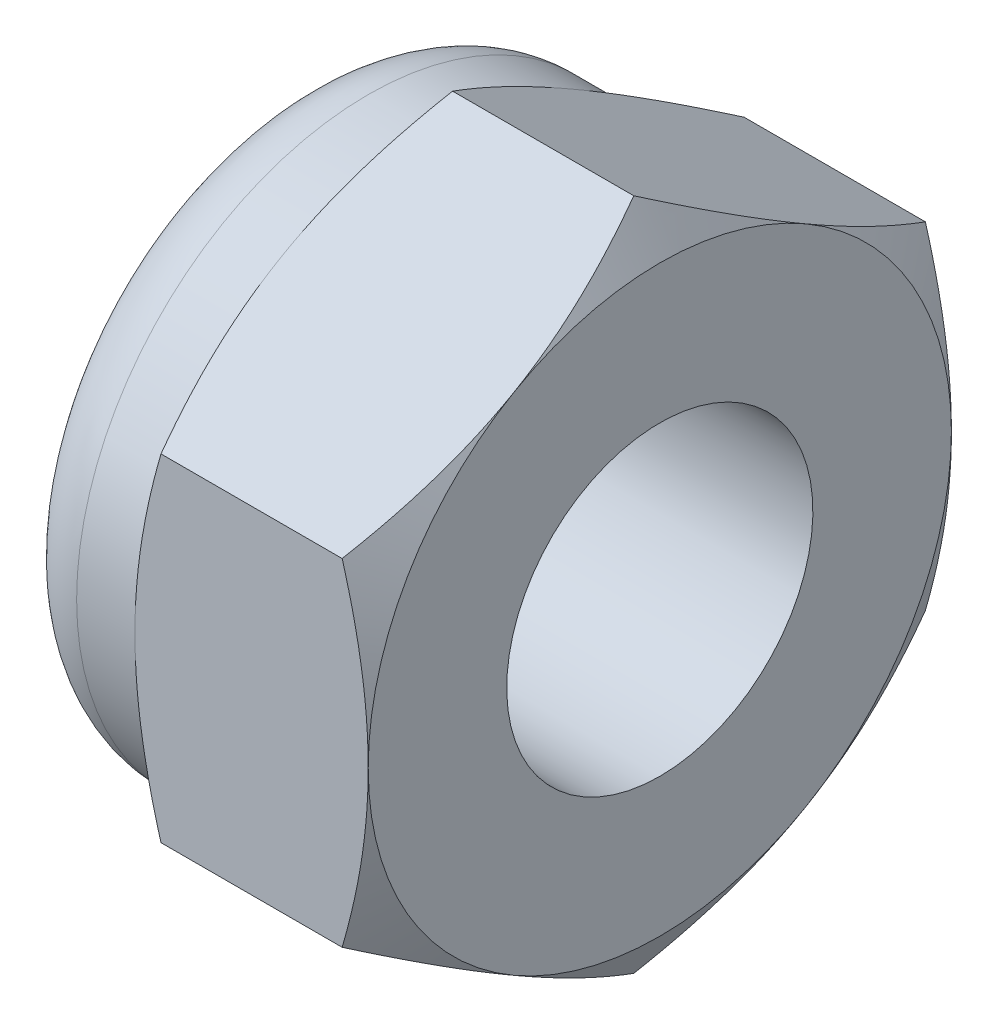
ISO-10303-21;
HEADER;
FILE_DESCRIPTION(('STEP AP214'),'2;1');
FILE_NAME('part.step','',(''),(''),'','','');
FILE_SCHEMA(('AUTOMOTIVE_DESIGN { 1 0 10303 214 1 1 1 1 }'));
ENDSEC;
DATA;
#1=APPLICATION_CONTEXT('core data for automotive mechanical design processes');
#2=APPLICATION_PROTOCOL_DEFINITION('international standard','automotive_design',2000,#1);
#3=PRODUCT_CONTEXT('',#1,'mechanical');
#4=PRODUCT('Part','Part','',(#3));
#5=PRODUCT_RELATED_PRODUCT_CATEGORY('part','',(#4));
#6=PRODUCT_DEFINITION_FORMATION('','',#4);
#7=PRODUCT_DEFINITION_CONTEXT('part definition',#1,'design');
#8=PRODUCT_DEFINITION('design','',#6,#7);
#9=PRODUCT_DEFINITION_SHAPE('','',#8);
#10=(LENGTH_UNIT() NAMED_UNIT(*) SI_UNIT(.MILLI.,.METRE.));
#11=(NAMED_UNIT(*) PLANE_ANGLE_UNIT() SI_UNIT($,.RADIAN.));
#12=(NAMED_UNIT(*) SI_UNIT($,.STERADIAN.) SOLID_ANGLE_UNIT());
#13=UNCERTAINTY_MEASURE_WITH_UNIT(LENGTH_MEASURE(1.E-05),#10,'distance_accuracy_value','');
#14=(GEOMETRIC_REPRESENTATION_CONTEXT(3) GLOBAL_UNCERTAINTY_ASSIGNED_CONTEXT((#13)) GLOBAL_UNIT_ASSIGNED_CONTEXT((#10,
#11,#12)) REPRESENTATION_CONTEXT('',''));
#15=CARTESIAN_POINT('',(0.,0.,0.));
#16=DIRECTION('',(0.,0.,1.));
#17=DIRECTION('',(1.,0.,0.));
#18=AXIS2_PLACEMENT_3D('',#15,#16,#17);
#19=CARTESIAN_POINT('',(-5.,2.30940107675851,-4.));
#20=DIRECTION('',(0.,0.866025403784439,-0.5));
#21=DIRECTION('',(0.,0.5,0.866025403784439));
#22=AXIS2_PLACEMENT_3D('',#19,#20,#21);
#23=PLANE('',#22);
#24=DIRECTION('',(1.,0.,0.));
#25=VECTOR('',#24,1.);
#26=CARTESIAN_POINT('',(-5.,2.30940107675851,-4.));
#27=LINE('',#26,#25);
#28=CARTESIAN_POINT('',(-2.84273441009184,2.30940107675851,-4.));
#29=VERTEX_POINT('',#28);
#30=CARTESIAN_POINT('',(-0.357265589908158,2.30940107675851,-4.));
#31=VERTEX_POINT('',#30);
#32=EDGE_CURVE('E144',#29,#31,#27,.T.);
#33=ORIENTED_EDGE('',*,*,#32,.F.);
#34=CARTESIAN_POINT('',(-2.84266774092524,2.30928560670467,-4.0002));
#35=CARTESIAN_POINT('',(-2.90128212635172,2.41077174646171,-3.82442084967677));
#36=CARTESIAN_POINT('',(-2.95458967853774,2.513133908835,-3.64712438367362));
#37=CARTESIAN_POINT('',(-3.0476383292536,2.71963072479812,-3.28946140682429));
#38=CARTESIAN_POINT('',(-3.0873465109703,2.82376904741904,-3.10908854102985));
#39=CARTESIAN_POINT('',(-3.14915778471972,3.03075510011795,-2.75057818129721));
#40=CARTESIAN_POINT('',(-3.17167226847711,3.13357098372492,-2.57249584706486));
#41=CARTESIAN_POINT('',(-3.19854937685342,3.33968651028528,-2.21549328283349));
#42=CARTESIAN_POINT('',(-3.20293425857306,3.44298540411434,-2.0365743503559));
#43=CARTESIAN_POINT('',(-3.19380992706003,3.63600352522932,-1.70225715780327));
#44=CARTESIAN_POINT('',(-3.18254104601201,3.72575165335065,-1.54680884001294));
#45=CARTESIAN_POINT('',(-3.14682600920181,3.90466320392054,-1.23692494436495));
#46=CARTESIAN_POINT('',(-3.12236765428847,3.99382600759478,-1.08249043825587));
#47=CARTESIAN_POINT('',(-3.06122393508071,4.17310641015197,-0.771967672225425));
#48=CARTESIAN_POINT('',(-3.02427939634514,4.26320131938131,-0.615918711936901));
#49=CARTESIAN_POINT('',(-2.94042992745197,4.4420474282755,-0.306148164596164));
#50=CARTESIAN_POINT('',(-2.89354469778726,4.53080091904966,-0.152422609226224));
#51=CARTESIAN_POINT('',(-2.84266774092524,4.61891762357084,0.000199999999999453));
#52=B_SPLINE_CURVE_WITH_KNOTS('',3,(#34,#35,#36,#37,#38,#39,#40,#41,#42,#43,#44,#45,#46,#47,#48,
#49,#50,#51),.UNSPECIFIED.,.F.,.F.,(4,2,2,2,2,2,2,2,4),(0.,0.634047835695964,1.26961969224543,
1.88946157213122,2.50854226669297,3.04757825393385,3.58711366126903,4.13861653143763,
4.68903648037742),.UNSPECIFIED.);
#53=CARTESIAN_POINT('',(-3.2,3.46410161513775,-2.));
#54=VERTEX_POINT('',#53);
#55=EDGE_CURVE('E264',#29,#54,#52,.T.);
#56=ORIENTED_EDGE('',*,*,#55,.T.);
#57=CARTESIAN_POINT('',(-2.84273441009184,4.61880215351701,0.));
#58=VERTEX_POINT('',#57);
#59=EDGE_CURVE('E258',#54,#58,#52,.T.);
#60=ORIENTED_EDGE('',*,*,#59,.T.);
#61=DIRECTION('',(1.,0.,0.));
#62=VECTOR('',#61,1.);
#63=CARTESIAN_POINT('',(-5.,4.61880215351701,0.));
#64=LINE('',#63,#62);
#65=CARTESIAN_POINT('',(-0.357265589908158,4.61880215351701,0.));
#66=VERTEX_POINT('',#65);
#67=EDGE_CURVE('E151',#58,#66,#64,.T.);
#68=ORIENTED_EDGE('',*,*,#67,.T.);
#69=CARTESIAN_POINT('',(-0.357332259074763,4.61891762357084,0.000199999999999655));
#70=CARTESIAN_POINT('',(-0.298717873648277,4.5174314838138,-0.175579150323229));
#71=CARTESIAN_POINT('',(-0.245410321462257,4.41506932144052,-0.352875616326382));
#72=CARTESIAN_POINT('',(-0.152361670746398,4.2085725054774,-0.710538593175708));
#73=CARTESIAN_POINT('',(-0.112653489029699,4.10443418285647,-0.890911458970152));
#74=CARTESIAN_POINT('',(-0.0508422152802733,3.89744813015756,-1.24942181870279));
#75=CARTESIAN_POINT('',(-0.0283277315228823,3.79463224655059,-1.42750415293514));
#76=CARTESIAN_POINT('',(-0.00145062314657792,3.58851671999023,-1.78450671716651));
#77=CARTESIAN_POINT('',(0.00293425857305713,3.48521782616117,-1.9634256496441));
#78=CARTESIAN_POINT('',(-0.00619007293996925,3.29219970504619,-2.29774284219673));
#79=CARTESIAN_POINT('',(-0.01745895398799,3.20245157692487,-2.45319115998707));
#80=CARTESIAN_POINT('',(-0.0531739907981864,3.02354002635497,-2.76307505563506));
#81=CARTESIAN_POINT('',(-0.077632345711527,2.93437722268073,-2.91750956174413));
#82=CARTESIAN_POINT('',(-0.138776064919284,2.75509682012354,-3.22803232777458));
#83=CARTESIAN_POINT('',(-0.175720603654858,2.6650019108942,-3.3840812880631));
#84=CARTESIAN_POINT('',(-0.259570072548021,2.48615580200001,-3.69385183540384));
#85=CARTESIAN_POINT('',(-0.306455302212735,2.39740231122585,-3.84757739077378));
#86=CARTESIAN_POINT('',(-0.357332259074763,2.30928560670467,-4.0002));
#87=B_SPLINE_CURVE_WITH_KNOTS('',3,(#69,#70,#71,#72,#73,#74,#75,#76,#77,#78,#79,#80,#81,#82,#83,
#84,#85,#86),.UNSPECIFIED.,.F.,.F.,(4,2,2,2,2,2,2,2,4),(0.,0.634047835695966,1.26961969224543,
1.88946157213122,2.50854226669297,3.04757825393385,3.58711366126903,4.13861653143763,
4.68903648037743),.UNSPECIFIED.);
#88=CARTESIAN_POINT('',(0.,3.46410161513775,-2.));
#89=VERTEX_POINT('',#88);
#90=EDGE_CURVE('E309',#66,#89,#87,.T.);
#91=ORIENTED_EDGE('',*,*,#90,.T.);
#92=EDGE_CURVE('E212',#89,#31,#87,.T.);
#93=ORIENTED_EDGE('',*,*,#92,.T.);
#94=EDGE_LOOP('',(#33,#56,#60,#68,#91,#93));
#95=FACE_BOUND('',#94,.T.);
#96=ADVANCED_FACE('F16',(#95),#23,.T.);
#97=CARTESIAN_POINT('',(-5.,-2.30940107675851,-4.));
#98=DIRECTION('',(0.,0.,-1.));
#99=DIRECTION('',(-1.,0.,0.));
#100=AXIS2_PLACEMENT_3D('',#97,#98,#99);
#101=PLANE('',#100);
#102=DIRECTION('',(1.,0.,0.));
#103=VECTOR('',#102,1.);
#104=CARTESIAN_POINT('',(-5.,-2.30940107675851,-4.));
#105=LINE('',#104,#103);
#106=CARTESIAN_POINT('',(-2.84273441009184,-2.30940107675851,-4.));
#107=VERTEX_POINT('',#106);
#108=CARTESIAN_POINT('',(-0.357265589908158,-2.30940107675851,-4.));
#109=VERTEX_POINT('',#108);
#110=EDGE_CURVE('E141',#107,#109,#105,.T.);
#111=ORIENTED_EDGE('',*,*,#110,.F.);
#112=CARTESIAN_POINT('',(-1.28589317875939,-6.12487198995892,-4.));
#113=CARTESIAN_POINT('',(-1.37076372923312,-5.94924937038676,-4.));
#114=CARTESIAN_POINT('',(-1.45479059619262,-5.77321152095285,-4.));
#115=CARTESIAN_POINT('',(-1.62067485320285,-5.42008084777954,-4.));
#116=CARTESIAN_POINT('',(-1.70253186763278,-5.24298784779927,-4.));
#117=CARTESIAN_POINT('',(-1.86402553694145,-4.88656571686333,-4.));
#118=CARTESIAN_POINT('',(-1.94364680493697,-4.70722958889362,-4.));
#119=CARTESIAN_POINT('',(-2.09946941457971,-4.34708334747263,-4.));
#120=CARTESIAN_POINT('',(-2.17567093449199,-4.16627331143537,-4.));
#121=CARTESIAN_POINT('',(-2.32464934960564,-3.80064706744977,-4.));
#122=CARTESIAN_POINT('',(-2.39737271578416,-3.61580892822769,-4.));
#123=CARTESIAN_POINT('',(-2.53712376904059,-3.24395246794968,-4.));
#124=CARTESIAN_POINT('',(-2.6041508224335,-3.05693390695801,-4.));
#125=CARTESIAN_POINT('',(-2.73070825156912,-2.6808031825377,-4.));
#126=CARTESIAN_POINT('',(-2.79025456521616,-2.49169643712848,-4.));
#127=CARTESIAN_POINT('',(-2.8999166434555,-2.11079454635851,-4.));
#128=CARTESIAN_POINT('',(-2.95003539032325,-1.91900027185749,-4.));
#129=CARTESIAN_POINT('',(-3.03840920504596,-1.532592326982,-4.));
#130=CARTESIAN_POINT('',(-3.07666111404346,-1.3379779203165,-4.));
#131=CARTESIAN_POINT('',(-3.13872576407766,-0.946402725872555,-4.));
#132=CARTESIAN_POINT('',(-3.1625384923483,-0.749441936019775,-4.));
#133=CARTESIAN_POINT('',(-3.19361818685056,-0.355451989627945,-4.));
#134=CARTESIAN_POINT('',(-3.20098990076104,-0.158431311094014,-4.));
#135=CARTESIAN_POINT('',(-3.19879593362521,0.235472085607466,-4.));
#136=CARTESIAN_POINT('',(-3.18923464918465,0.432354826312202,-4.));
#137=CARTESIAN_POINT('',(-3.15912126538641,0.768560635225515,-4.));
#138=CARTESIAN_POINT('',(-3.14249070395609,0.90825461838182,-4.));
#139=CARTESIAN_POINT('',(-3.10178658965331,1.18656349063498,-4.));
#140=CARTESIAN_POINT('',(-3.07771186294155,1.32517820601014,-4.));
#141=CARTESIAN_POINT('',(-2.99558492904977,1.73929045452971,-4.));
#142=CARTESIAN_POINT('',(-2.92765111357484,2.01284690528724,-4.));
#143=CARTESIAN_POINT('',(-2.81048364068279,2.42218253014527,-4.));
#144=CARTESIAN_POINT('',(-2.76828605818836,2.56009536361542,-4.));
#145=CARTESIAN_POINT('',(-2.67971541977223,2.83448159101407,-4.));
#146=CARTESIAN_POINT('',(-2.63334524381308,2.97095590623561,-4.));
#147=CARTESIAN_POINT('',(-2.5373943008197,3.24189440516345,-4.));
#148=CARTESIAN_POINT('',(-2.48783307424649,3.37636557946842,-4.));
#149=CARTESIAN_POINT('',(-2.38580164620928,3.64426461152919,-4.));
#150=CARTESIAN_POINT('',(-2.33333026903662,3.77769202239392,-4.));
#151=CARTESIAN_POINT('',(-2.2796909934582,3.9106369898669,-4.));
#152=B_SPLINE_CURVE_WITH_KNOTS('',3,(#112,#113,#114,#115,#116,#117,#118,#119,#120,#121,#122,
#123,#124,#125,#126,#127,#128,#129,#130,#131,#132,#133,#134,#135,#136,#137,#138,#139,#140,#141,
#142,#143,#144,#145,#146,#147,#148,#149,#150,#151),.UNSPECIFIED.,.F.,.F.,(4,2,2,2,2,2,2,2,2,2,2,
2,2,2,2,2,2,2,2,4),(0.,0.58517179253227,1.17044423059926,1.75906594645989,2.34765694284826,
2.94347400997483,3.53935727210688,4.13394864697599,4.7283516139147,5.32291267067844,
5.91747425310811,6.50823685854035,7.09884609659885,7.5206814082552,7.94258327130839,
8.78701491359831,9.21965281897691,9.651994371163,10.0819024146297,10.5119854255247),.UNSPECIFIED.);
#153=CARTESIAN_POINT('',(-3.2,0.,-4.));
#154=VERTEX_POINT('',#153);
#155=EDGE_CURVE('E134',#107,#154,#152,.T.);
#156=ORIENTED_EDGE('',*,*,#155,.T.);
#157=EDGE_CURVE('E227',#154,#29,#152,.T.);
#158=ORIENTED_EDGE('',*,*,#157,.T.);
#159=ORIENTED_EDGE('',*,*,#32,.T.);
#160=CARTESIAN_POINT('',(-1.91410682124061,-6.12487198995892,-4.));
#161=CARTESIAN_POINT('',(-1.82923627076688,-5.94924937038676,-4.));
#162=CARTESIAN_POINT('',(-1.74520940380738,-5.77321152095285,-4.));
#163=CARTESIAN_POINT('',(-1.57932514679715,-5.42008084777954,-4.));
#164=CARTESIAN_POINT('',(-1.49746813236722,-5.24298784779927,-4.));
#165=CARTESIAN_POINT('',(-1.33597446305854,-4.88656571686333,-4.));
#166=CARTESIAN_POINT('',(-1.25635319506302,-4.70722958889361,-4.));
#167=CARTESIAN_POINT('',(-1.10053058542028,-4.34708334747263,-4.));
#168=CARTESIAN_POINT('',(-1.02432906550801,-4.16627331143537,-4.));
#169=CARTESIAN_POINT('',(-0.875350650394349,-3.80064706744977,-4.));
#170=CARTESIAN_POINT('',(-0.802627284215833,-3.61580892822769,-4.));
#171=CARTESIAN_POINT('',(-0.662876230959409,-3.24395246794968,-4.));
#172=CARTESIAN_POINT('',(-0.595849177566494,-3.05693390695801,-4.));
#173=CARTESIAN_POINT('',(-0.469291748430872,-2.6808031825377,-4.));
#174=CARTESIAN_POINT('',(-0.409745434783828,-2.49169643712848,-4.));
#175=CARTESIAN_POINT('',(-0.3000833565445,-2.11079454635851,-4.));
#176=CARTESIAN_POINT('',(-0.249964609676748,-1.91900027185749,-4.));
#177=CARTESIAN_POINT('',(-0.161590794954038,-1.532592326982,-4.));
#178=CARTESIAN_POINT('',(-0.123338885956534,-1.3379779203165,-4.));
#179=CARTESIAN_POINT('',(-0.0612742359223366,-0.946402725872557,-4.));
#180=CARTESIAN_POINT('',(-0.0374615076516934,-0.749441936019777,-4.));
#181=CARTESIAN_POINT('',(-0.00638181314943049,-0.355451989627945,-4.));
#182=CARTESIAN_POINT('',(0.000989900761048595,-0.158431311094014,-4.));
#183=CARTESIAN_POINT('',(-0.00120406637479137,0.235472085607466,-4.));
#184=CARTESIAN_POINT('',(-0.0107653508153509,0.432354826312202,-4.));
#185=CARTESIAN_POINT('',(-0.0408787346135895,0.768560635225517,-4.));
#186=CARTESIAN_POINT('',(-0.0575092960439055,0.908254618381822,-4.));
#187=CARTESIAN_POINT('',(-0.0982134103466857,1.18656349063498,-4.));
#188=CARTESIAN_POINT('',(-0.122288137058442,1.32517820601014,-4.));
#189=CARTESIAN_POINT('',(-0.204415070950229,1.73929045452971,-4.));
#190=CARTESIAN_POINT('',(-0.272348886425153,2.01284690528725,-4.));
#191=CARTESIAN_POINT('',(-0.389516359317206,2.42218253014527,-4.));
#192=CARTESIAN_POINT('',(-0.431713941811639,2.56009536361542,-4.));
#193=CARTESIAN_POINT('',(-0.520284580227767,2.83448159101408,-4.));
#194=CARTESIAN_POINT('',(-0.566654756186919,2.97095590623562,-4.));
#195=CARTESIAN_POINT('',(-0.662605699180295,3.24189440516345,-4.));
#196=CARTESIAN_POINT('',(-0.712166925753509,3.37636557946843,-4.));
#197=CARTESIAN_POINT('',(-0.814198353790713,3.64426461152919,-4.));
#198=CARTESIAN_POINT('',(-0.866669730963381,3.77769202239393,-4.));
#199=CARTESIAN_POINT('',(-0.920309006541804,3.9106369898669,-4.));
#200=B_SPLINE_CURVE_WITH_KNOTS('',3,(#160,#161,#162,#163,#164,#165,#166,#167,#168,#169,#170,
#171,#172,#173,#174,#175,#176,#177,#178,#179,#180,#181,#182,#183,#184,#185,#186,#187,#188,#189,
#190,#191,#192,#193,#194,#195,#196,#197,#198,#199),.UNSPECIFIED.,.F.,.F.,(4,2,2,2,2,2,2,2,2,2,2,
2,2,2,2,2,2,2,2,4),(0.,0.585171792532271,1.17044423059927,1.7590659464599,2.34765694284827,
2.94347400997483,3.53935727210688,4.13394864697599,4.7283516139147,5.32291267067844,
5.91747425310811,6.50823685854035,7.09884609659885,7.52068140825521,7.9425832713084,
8.78701491359832,9.21965281897692,9.65199437116301,10.0819024146297,10.5119854255247),.UNSPECIFIED.);
#201=CARTESIAN_POINT('',(0.,0.,-4.));
#202=VERTEX_POINT('',#201);
#203=EDGE_CURVE('E210',#31,#202,#200,.F.);
#204=ORIENTED_EDGE('',*,*,#203,.T.);
#205=EDGE_CURVE('E203',#202,#109,#200,.F.);
#206=ORIENTED_EDGE('',*,*,#205,.T.);
#207=EDGE_LOOP('',(#111,#156,#158,#159,#204,#206));
#208=FACE_BOUND('',#207,.T.);
#209=ADVANCED_FACE('F218',(#208),#101,.T.);
#210=CARTESIAN_POINT('',(-5.,-4.61880215351701,0.));
#211=DIRECTION('',(0.,-0.866025403784439,-0.5));
#212=DIRECTION('',(0.,0.5,-0.866025403784439));
#213=AXIS2_PLACEMENT_3D('',#210,#211,#212);
#214=PLANE('',#213);
#215=DIRECTION('',(1.,0.,0.));
#216=VECTOR('',#215,1.);
#217=CARTESIAN_POINT('',(-5.,-4.61880215351701,0.));
#218=LINE('',#217,#216);
#219=CARTESIAN_POINT('',(-2.84273441009184,-4.61880215351701,0.));
#220=VERTEX_POINT('',#219);
#221=CARTESIAN_POINT('',(-0.357265589908158,-4.61880215351701,0.));
#222=VERTEX_POINT('',#221);
#223=EDGE_CURVE('E131',#220,#222,#218,.T.);
#224=ORIENTED_EDGE('',*,*,#223,.F.);
#225=CARTESIAN_POINT('',(-2.84266774092524,-4.61891762357084,0.000200000000001212));
#226=CARTESIAN_POINT('',(-2.90128212635172,-4.5174314838138,-0.175579150323229));
#227=CARTESIAN_POINT('',(-2.95458967853774,-4.41506932144052,-0.352875616326382));
#228=CARTESIAN_POINT('',(-3.0476383292536,-4.2085725054774,-0.710538593175708));
#229=CARTESIAN_POINT('',(-3.08734651097029,-4.10443418285647,-0.890911458970152));
#230=CARTESIAN_POINT('',(-3.14915778471972,-3.89744813015756,-1.24942181870279));
#231=CARTESIAN_POINT('',(-3.17167226847711,-3.7946322465506,-1.42750415293514));
#232=CARTESIAN_POINT('',(-3.19854937685342,-3.58851671999023,-1.78450671716651));
#233=CARTESIAN_POINT('',(-3.20293425857306,-3.48521782616117,-1.9634256496441));
#234=CARTESIAN_POINT('',(-3.19380992706003,-3.29219970504619,-2.29774284219673));
#235=CARTESIAN_POINT('',(-3.182541046012,-3.20245157692487,-2.45319115998707));
#236=CARTESIAN_POINT('',(-3.14682600920181,-3.02354002635497,-2.76307505563506));
#237=CARTESIAN_POINT('',(-3.12236765428847,-2.93437722268073,-2.91750956174413));
#238=CARTESIAN_POINT('',(-3.06122393508071,-2.75509682012354,-3.22803232777458));
#239=CARTESIAN_POINT('',(-3.02427939634514,-2.6650019108942,-3.3840812880631));
#240=CARTESIAN_POINT('',(-2.94042992745197,-2.48615580200001,-3.69385183540384));
#241=CARTESIAN_POINT('',(-2.89354469778726,-2.39740231122585,-3.84757739077378));
#242=CARTESIAN_POINT('',(-2.84266774092524,-2.30928560670467,-4.0002));
#243=B_SPLINE_CURVE_WITH_KNOTS('',3,(#225,#226,#227,#228,#229,#230,#231,#232,#233,#234,#235,
#236,#237,#238,#239,#240,#241,#242),.UNSPECIFIED.,.F.,.F.,(4,2,2,2,2,2,2,2,4),(0.,
0.634047835695965,1.26961969224543,1.88946157213122,2.50854226669297,3.04757825393385,
3.58711366126903,4.13861653143763,4.68903648037742),.UNSPECIFIED.);
#244=CARTESIAN_POINT('',(-3.2,-3.46410161513775,-2.));
#245=VERTEX_POINT('',#244);
#246=EDGE_CURVE('E113',#220,#245,#243,.T.);
#247=ORIENTED_EDGE('',*,*,#246,.T.);
#248=EDGE_CURVE('E124',#245,#107,#243,.T.);
#249=ORIENTED_EDGE('',*,*,#248,.T.);
#250=ORIENTED_EDGE('',*,*,#110,.T.);
#251=CARTESIAN_POINT('',(-0.357332259074764,-2.30928560670467,-4.0002));
#252=CARTESIAN_POINT('',(-0.298717873648278,-2.41077174646171,-3.82442084967677));
#253=CARTESIAN_POINT('',(-0.245410321462257,-2.513133908835,-3.64712438367362));
#254=CARTESIAN_POINT('',(-0.152361670746398,-2.71963072479812,-3.28946140682429));
#255=CARTESIAN_POINT('',(-0.112653489029699,-2.82376904741905,-3.10908854102985));
#256=CARTESIAN_POINT('',(-0.0508422152802738,-3.03075510011795,-2.75057818129721));
#257=CARTESIAN_POINT('',(-0.0283277315228827,-3.13357098372492,-2.57249584706486));
#258=CARTESIAN_POINT('',(-0.00145062314657854,-3.33968651028529,-2.21549328283349));
#259=CARTESIAN_POINT('',(0.00293425857305633,-3.44298540411434,-2.0365743503559));
#260=CARTESIAN_POINT('',(-0.00619007293997007,-3.63600352522933,-1.70225715780327));
#261=CARTESIAN_POINT('',(-0.0174589539879907,-3.72575165335065,-1.54680884001293));
#262=CARTESIAN_POINT('',(-0.053173990798187,-3.90466320392055,-1.23692494436494));
#263=CARTESIAN_POINT('',(-0.0776323457115277,-3.99382600759479,-1.08249043825587));
#264=CARTESIAN_POINT('',(-0.138776064919285,-4.17310641015197,-0.771967672225423));
#265=CARTESIAN_POINT('',(-0.175720603654858,-4.26320131938131,-0.615918711936899));
#266=CARTESIAN_POINT('',(-0.259570072548022,-4.4420474282755,-0.306148164596162));
#267=CARTESIAN_POINT('',(-0.306455302212735,-4.53080091904966,-0.152422609226222));
#268=CARTESIAN_POINT('',(-0.357332259074763,-4.61891762357084,0.000200000000000776));
#269=B_SPLINE_CURVE_WITH_KNOTS('',3,(#251,#252,#253,#254,#255,#256,#257,#258,#259,#260,#261,
#262,#263,#264,#265,#266,#267,#268),.UNSPECIFIED.,.F.,.F.,(4,2,2,2,2,2,2,2,4),(0.,
0.634047835695966,1.26961969224543,1.88946157213122,2.50854226669297,3.04757825393386,
3.58711366126903,4.13861653143763,4.68903648037743),.UNSPECIFIED.);
#270=CARTESIAN_POINT('',(0.,-3.46410161513775,-2.));
#271=VERTEX_POINT('',#270);
#272=EDGE_CURVE('E211',#109,#271,#269,.T.);
#273=ORIENTED_EDGE('',*,*,#272,.T.);
#274=EDGE_CURVE('E140',#271,#222,#269,.T.);
#275=ORIENTED_EDGE('',*,*,#274,.T.);
#276=EDGE_LOOP('',(#224,#247,#249,#250,#273,#275));
#277=FACE_BOUND('',#276,.T.);
#278=ADVANCED_FACE('F137',(#277),#214,.T.);
#279=CARTESIAN_POINT('',(-5.,-2.30940107675851,4.));
#280=DIRECTION('',(0.,-0.866025403784439,0.5));
#281=DIRECTION('',(0.,-0.5,-0.866025403784439));
#282=AXIS2_PLACEMENT_3D('',#279,#280,#281);
#283=PLANE('',#282);
#284=DIRECTION('',(1.,0.,0.));
#285=VECTOR('',#284,1.);
#286=CARTESIAN_POINT('',(-5.,-2.30940107675851,4.));
#287=LINE('',#286,#285);
#288=CARTESIAN_POINT('',(-2.84273441009184,-2.3094010767585,4.));
#289=VERTEX_POINT('',#288);
#290=CARTESIAN_POINT('',(-0.357265589908158,-2.3094010767585,4.));
#291=VERTEX_POINT('',#290);
#292=EDGE_CURVE('E142',#289,#291,#287,.T.);
#293=ORIENTED_EDGE('',*,*,#292,.F.);
#294=CARTESIAN_POINT('',(-2.84266774092524,-2.30928560670467,4.0002));
#295=CARTESIAN_POINT('',(-2.90128212635172,-2.41077174646171,3.82442084967677));
#296=CARTESIAN_POINT('',(-2.95458967853774,-2.513133908835,3.64712438367362));
#297=CARTESIAN_POINT('',(-3.0476383292536,-2.71963072479812,3.28946140682429));
#298=CARTESIAN_POINT('',(-3.0873465109703,-2.82376904741904,3.10908854102985));
#299=CARTESIAN_POINT('',(-3.14915778471972,-3.03075510011795,2.75057818129721));
#300=CARTESIAN_POINT('',(-3.17167226847711,-3.13357098372492,2.57249584706486));
#301=CARTESIAN_POINT('',(-3.19854937685342,-3.33968651028528,2.21549328283349));
#302=CARTESIAN_POINT('',(-3.20293425857305,-3.44298540411434,2.0365743503559));
#303=CARTESIAN_POINT('',(-3.19380992706003,-3.63600352522932,1.70225715780327));
#304=CARTESIAN_POINT('',(-3.18254104601201,-3.72575165335065,1.54680884001294));
#305=CARTESIAN_POINT('',(-3.14682600920181,-3.90466320392054,1.23692494436495));
#306=CARTESIAN_POINT('',(-3.12236765428847,-3.99382600759478,1.08249043825587));
#307=CARTESIAN_POINT('',(-3.06122393508071,-4.17310641015197,0.771967672225425));
#308=CARTESIAN_POINT('',(-3.02427939634514,-4.26320131938131,0.615918711936902));
#309=CARTESIAN_POINT('',(-2.94042992745198,-4.4420474282755,0.306148164596165));
#310=CARTESIAN_POINT('',(-2.89354469778726,-4.53080091904966,0.152422609226225));
#311=CARTESIAN_POINT('',(-2.84266774092524,-4.61891762357084,-0.000199999999998813));
#312=B_SPLINE_CURVE_WITH_KNOTS('',3,(#294,#295,#296,#297,#298,#299,#300,#301,#302,#303,#304,
#305,#306,#307,#308,#309,#310,#311),.UNSPECIFIED.,.F.,.F.,(4,2,2,2,2,2,2,2,4),(0.,
0.634047835695966,1.26961969224543,1.88946157213122,2.50854226669297,3.04757825393385,
3.58711366126903,4.13861653143763,4.68903648037743),.UNSPECIFIED.);
#313=CARTESIAN_POINT('',(-3.2,-3.46410161513775,2.));
#314=VERTEX_POINT('',#313);
#315=EDGE_CURVE('E133',#289,#314,#312,.T.);
#316=ORIENTED_EDGE('',*,*,#315,.T.);
#317=EDGE_CURVE('E116',#314,#220,#312,.T.);
#318=ORIENTED_EDGE('',*,*,#317,.T.);
#319=ORIENTED_EDGE('',*,*,#223,.T.);
#320=CARTESIAN_POINT('',(-0.357332259074763,-4.61891762357084,-0.000199999999998869));
#321=CARTESIAN_POINT('',(-0.298717873648277,-4.5174314838138,0.17557915032323));
#322=CARTESIAN_POINT('',(-0.245410321462257,-4.41506932144052,0.352875616326383));
#323=CARTESIAN_POINT('',(-0.152361670746398,-4.2085725054774,0.710538593175708));
#324=CARTESIAN_POINT('',(-0.112653489029699,-4.10443418285647,0.890911458970152));
#325=CARTESIAN_POINT('',(-0.0508422152802731,-3.89744813015756,1.24942181870279));
#326=CARTESIAN_POINT('',(-0.0283277315228817,-3.7946322465506,1.42750415293514));
#327=CARTESIAN_POINT('',(-0.00145062314657797,-3.58851671999023,1.78450671716651));
#328=CARTESIAN_POINT('',(0.00293425857305621,-3.48521782616117,1.9634256496441));
#329=CARTESIAN_POINT('',(-0.00619007293997003,-3.29219970504619,2.29774284219673));
#330=CARTESIAN_POINT('',(-0.01745895398799,-3.20245157692487,2.45319115998707));
#331=CARTESIAN_POINT('',(-0.0531739907981861,-3.02354002635497,2.76307505563506));
#332=CARTESIAN_POINT('',(-0.0776323457115273,-2.93437722268073,2.91750956174413));
#333=CARTESIAN_POINT('',(-0.138776064919284,-2.75509682012354,3.22803232777458));
#334=CARTESIAN_POINT('',(-0.175720603654858,-2.6650019108942,3.3840812880631));
#335=CARTESIAN_POINT('',(-0.259570072548021,-2.48615580200001,3.69385183540384));
#336=CARTESIAN_POINT('',(-0.306455302212734,-2.39740231122585,3.84757739077378));
#337=CARTESIAN_POINT('',(-0.357332259074763,-2.30928560670467,4.0002));
#338=B_SPLINE_CURVE_WITH_KNOTS('',3,(#320,#321,#322,#323,#324,#325,#326,#327,#328,#329,#330,
#331,#332,#333,#334,#335,#336,#337),.UNSPECIFIED.,.F.,.F.,(4,2,2,2,2,2,2,2,4),(0.,
0.634047835695965,1.26961969224543,1.88946157213122,2.50854226669297,3.04757825393385,
3.58711366126903,4.13861653143763,4.68903648037743),.UNSPECIFIED.);
#339=CARTESIAN_POINT('',(0.,-3.46410161513775,2.));
#340=VERTEX_POINT('',#339);
#341=EDGE_CURVE('E282',#222,#340,#338,.T.);
#342=ORIENTED_EDGE('',*,*,#341,.T.);
#343=EDGE_CURVE('E190',#340,#291,#338,.T.);
#344=ORIENTED_EDGE('',*,*,#343,.T.);
#345=EDGE_LOOP('',(#293,#316,#318,#319,#342,#344));
#346=FACE_BOUND('',#345,.T.);
#347=ADVANCED_FACE('F129',(#346),#283,.T.);
#348=CARTESIAN_POINT('',(-5.,2.30940107675851,4.));
#349=DIRECTION('',(0.,0.,1.));
#350=DIRECTION('',(1.,0.,0.));
#351=AXIS2_PLACEMENT_3D('',#348,#349,#350);
#352=PLANE('',#351);
#353=DIRECTION('',(1.,0.,0.));
#354=VECTOR('',#353,1.);
#355=CARTESIAN_POINT('',(-5.,2.30940107675851,4.));
#356=LINE('',#355,#354);
#357=CARTESIAN_POINT('',(-2.84273441009184,2.30940107675851,4.));
#358=VERTEX_POINT('',#357);
#359=CARTESIAN_POINT('',(-0.357265589908158,2.30940107675851,4.));
#360=VERTEX_POINT('',#359);
#361=EDGE_CURVE('E146',#358,#360,#356,.T.);
#362=ORIENTED_EDGE('',*,*,#361,.F.);
#363=CARTESIAN_POINT('',(-1.28589317875939,-6.12487198995892,4.));
#364=CARTESIAN_POINT('',(-1.37076372923312,-5.94924937038676,4.));
#365=CARTESIAN_POINT('',(-1.45479059619262,-5.77321152095285,4.));
#366=CARTESIAN_POINT('',(-1.62067485320285,-5.42008084777954,4.));
#367=CARTESIAN_POINT('',(-1.70253186763278,-5.24298784779927,4.));
#368=CARTESIAN_POINT('',(-1.86402553694145,-4.88656571686333,4.));
#369=CARTESIAN_POINT('',(-1.94364680493697,-4.70722958889361,4.));
#370=CARTESIAN_POINT('',(-2.09946941457971,-4.34708334747262,4.));
#371=CARTESIAN_POINT('',(-2.17567093449199,-4.16627331143537,4.));
#372=CARTESIAN_POINT('',(-2.32464934960564,-3.80064706744977,4.));
#373=CARTESIAN_POINT('',(-2.39737271578416,-3.61580892822769,4.));
#374=CARTESIAN_POINT('',(-2.53712376904059,-3.24395246794968,4.));
#375=CARTESIAN_POINT('',(-2.6041508224335,-3.05693390695801,4.));
#376=CARTESIAN_POINT('',(-2.73070825156912,-2.6808031825377,4.));
#377=CARTESIAN_POINT('',(-2.79025456521617,-2.49169643712848,4.));
#378=CARTESIAN_POINT('',(-2.8999166434555,-2.11079454635851,4.));
#379=CARTESIAN_POINT('',(-2.95003539032325,-1.91900027185748,4.));
#380=CARTESIAN_POINT('',(-3.03840920504596,-1.532592326982,4.));
#381=CARTESIAN_POINT('',(-3.07666111404346,-1.33797792031649,4.));
#382=CARTESIAN_POINT('',(-3.13872576407766,-0.946402725872551,4.));
#383=CARTESIAN_POINT('',(-3.1625384923483,-0.749441936019772,4.));
#384=CARTESIAN_POINT('',(-3.19361818685056,-0.355451989627942,4.));
#385=CARTESIAN_POINT('',(-3.20098990076104,-0.158431311094011,4.));
#386=CARTESIAN_POINT('',(-3.19879593362521,0.235472085607468,4.));
#387=CARTESIAN_POINT('',(-3.18923464918465,0.432354826312204,4.));
#388=CARTESIAN_POINT('',(-3.15912126538641,0.768560635225518,4.));
#389=CARTESIAN_POINT('',(-3.14249070395609,0.908254618381823,4.));
#390=CARTESIAN_POINT('',(-3.10178658965331,1.18656349063498,4.));
#391=CARTESIAN_POINT('',(-3.07771186294155,1.32517820601014,4.));
#392=CARTESIAN_POINT('',(-2.99558492904977,1.73929045452971,4.));
#393=CARTESIAN_POINT('',(-2.92765111357484,2.01284690528725,4.));
#394=CARTESIAN_POINT('',(-2.81048364068279,2.42218253014527,4.));
#395=CARTESIAN_POINT('',(-2.76828605818835,2.56009536361542,4.));
#396=CARTESIAN_POINT('',(-2.67971541977223,2.83448159101408,4.));
#397=CARTESIAN_POINT('',(-2.63334524381308,2.97095590623562,4.));
#398=CARTESIAN_POINT('',(-2.5373943008197,3.24189440516345,4.));
#399=CARTESIAN_POINT('',(-2.48783307424648,3.37636557946843,4.));
#400=CARTESIAN_POINT('',(-2.38580164620928,3.64426461152919,4.));
#401=CARTESIAN_POINT('',(-2.33333026903661,3.77769202239393,4.));
#402=CARTESIAN_POINT('',(-2.2796909934582,3.91063698986691,4.));
#403=B_SPLINE_CURVE_WITH_KNOTS('',3,(#363,#364,#365,#366,#367,#368,#369,#370,#371,#372,#373,
#374,#375,#376,#377,#378,#379,#380,#381,#382,#383,#384,#385,#386,#387,#388,#389,#390,#391,#392,
#393,#394,#395,#396,#397,#398,#399,#400,#401,#402),.UNSPECIFIED.,.F.,.F.,(4,2,2,2,2,2,2,2,2,2,2,
2,2,2,2,2,2,2,2,4),(0.,0.585171792532271,1.17044423059927,1.75906594645989,2.34765694284826,
2.94347400997483,3.53935727210688,4.133948646976,4.7283516139147,5.32291267067844,
5.91747425310812,6.50823685854035,7.09884609659885,7.52068140825521,7.9425832713084,
8.78701491359831,9.21965281897692,9.65199437116301,10.0819024146297,10.5119854255247),.UNSPECIFIED.);
#404=CARTESIAN_POINT('',(-3.2,0.,4.));
#405=VERTEX_POINT('',#404);
#406=EDGE_CURVE('E36',#358,#405,#403,.F.);
#407=ORIENTED_EDGE('',*,*,#406,.T.);
#408=EDGE_CURVE('E268',#405,#289,#403,.F.);
#409=ORIENTED_EDGE('',*,*,#408,.T.);
#410=ORIENTED_EDGE('',*,*,#292,.T.);
#411=CARTESIAN_POINT('',(-1.91410682124061,-6.12487198995892,4.));
#412=CARTESIAN_POINT('',(-1.82923627076688,-5.94924937038676,4.));
#413=CARTESIAN_POINT('',(-1.74520940380738,-5.77321152095285,4.));
#414=CARTESIAN_POINT('',(-1.57932514679715,-5.42008084777954,4.));
#415=CARTESIAN_POINT('',(-1.49746813236722,-5.24298784779927,4.));
#416=CARTESIAN_POINT('',(-1.33597446305854,-4.88656571686333,4.));
#417=CARTESIAN_POINT('',(-1.25635319506302,-4.70722958889362,4.));
#418=CARTESIAN_POINT('',(-1.10053058542028,-4.34708334747263,4.));
#419=CARTESIAN_POINT('',(-1.02432906550801,-4.16627331143537,4.));
#420=CARTESIAN_POINT('',(-0.875350650394349,-3.80064706744977,4.));
#421=CARTESIAN_POINT('',(-0.802627284215833,-3.61580892822769,4.));
#422=CARTESIAN_POINT('',(-0.662876230959409,-3.24395246794968,4.));
#423=CARTESIAN_POINT('',(-0.595849177566494,-3.05693390695801,4.));
#424=CARTESIAN_POINT('',(-0.469291748430872,-2.6808031825377,4.));
#425=CARTESIAN_POINT('',(-0.409745434783827,-2.49169643712848,4.));
#426=CARTESIAN_POINT('',(-0.300083356544499,-2.11079454635851,4.));
#427=CARTESIAN_POINT('',(-0.249964609676748,-1.91900027185748,4.));
#428=CARTESIAN_POINT('',(-0.161590794954039,-1.532592326982,4.));
#429=CARTESIAN_POINT('',(-0.123338885956534,-1.33797792031649,4.));
#430=CARTESIAN_POINT('',(-0.0612742359223358,-0.946402725872553,4.));
#431=CARTESIAN_POINT('',(-0.0374615076516928,-0.749441936019773,4.));
#432=CARTESIAN_POINT('',(-0.00638181314943017,-0.355451989627942,4.));
#433=CARTESIAN_POINT('',(0.000989900761048829,-0.158431311094011,4.));
#434=CARTESIAN_POINT('',(-0.00120406637479155,0.235472085607468,4.));
#435=CARTESIAN_POINT('',(-0.0107653508153515,0.432354826312204,4.));
#436=CARTESIAN_POINT('',(-0.0408787346135901,0.768560635225518,4.));
#437=CARTESIAN_POINT('',(-0.057509296043906,0.908254618381824,4.));
#438=CARTESIAN_POINT('',(-0.0982134103466862,1.18656349063498,4.));
#439=CARTESIAN_POINT('',(-0.122288137058442,1.32517820601014,4.));
#440=CARTESIAN_POINT('',(-0.20441507095023,1.73929045452971,4.));
#441=CARTESIAN_POINT('',(-0.272348886425153,2.01284690528725,4.));
#442=CARTESIAN_POINT('',(-0.389516359317206,2.42218253014527,4.));
#443=CARTESIAN_POINT('',(-0.43171394181164,2.56009536361542,4.));
#444=CARTESIAN_POINT('',(-0.520284580227768,2.83448159101408,4.));
#445=CARTESIAN_POINT('',(-0.566654756186919,2.97095590623562,4.));
#446=CARTESIAN_POINT('',(-0.662605699180296,3.24189440516346,4.));
#447=CARTESIAN_POINT('',(-0.71216692575351,3.37636557946843,4.));
#448=CARTESIAN_POINT('',(-0.814198353790714,3.6442646115292,4.));
#449=CARTESIAN_POINT('',(-0.866669730963382,3.77769202239393,4.));
#450=CARTESIAN_POINT('',(-0.920309006541805,3.91063698986691,4.));
#451=B_SPLINE_CURVE_WITH_KNOTS('',3,(#411,#412,#413,#414,#415,#416,#417,#418,#419,#420,#421,
#422,#423,#424,#425,#426,#427,#428,#429,#430,#431,#432,#433,#434,#435,#436,#437,#438,#439,#440,
#441,#442,#443,#444,#445,#446,#447,#448,#449,#450),.UNSPECIFIED.,.F.,.F.,(4,2,2,2,2,2,2,2,2,2,2,
2,2,2,2,2,2,2,2,4),(0.,0.585171792532271,1.17044423059927,1.75906594645989,2.34765694284826,
2.94347400997483,3.53935727210688,4.133948646976,4.7283516139147,5.32291267067844,
5.91747425310812,6.50823685854035,7.09884609659885,7.52068140825521,7.9425832713084,
8.78701491359832,9.21965281897692,9.65199437116301,10.0819024146297,10.5119854255247),.UNSPECIFIED.);
#452=CARTESIAN_POINT('',(0.,0.,4.));
#453=VERTEX_POINT('',#452);
#454=EDGE_CURVE('E285',#291,#453,#451,.T.);
#455=ORIENTED_EDGE('',*,*,#454,.T.);
#456=EDGE_CURVE('E182',#453,#360,#451,.T.);
#457=ORIENTED_EDGE('',*,*,#456,.T.);
#458=EDGE_LOOP('',(#362,#407,#409,#410,#455,#457));
#459=FACE_BOUND('',#458,.T.);
#460=ADVANCED_FACE('F275',(#459),#352,.T.);
#461=CARTESIAN_POINT('',(-5.,4.61880215351701,0.));
#462=DIRECTION('',(0.,0.866025403784439,0.5));
#463=DIRECTION('',(0.,-0.5,0.866025403784439));
#464=AXIS2_PLACEMENT_3D('',#461,#462,#463);
#465=PLANE('',#464);
#466=ORIENTED_EDGE('',*,*,#67,.F.);
#467=CARTESIAN_POINT('',(-2.84266774092524,4.61891762357084,-0.000200000000000369));
#468=CARTESIAN_POINT('',(-2.90128212635172,4.5174314838138,0.17557915032323));
#469=CARTESIAN_POINT('',(-2.95458967853774,4.41506932144052,0.352875616326383));
#470=CARTESIAN_POINT('',(-3.0476383292536,4.2085725054774,0.710538593175708));
#471=CARTESIAN_POINT('',(-3.0873465109703,4.10443418285647,0.890911458970152));
#472=CARTESIAN_POINT('',(-3.14915778471972,3.89744813015756,1.24942181870279));
#473=CARTESIAN_POINT('',(-3.17167226847711,3.7946322465506,1.42750415293514));
#474=CARTESIAN_POINT('',(-3.19854937685342,3.58851671999023,1.78450671716651));
#475=CARTESIAN_POINT('',(-3.20293425857306,3.48521782616117,1.9634256496441));
#476=CARTESIAN_POINT('',(-3.19380992706003,3.29219970504619,2.29774284219673));
#477=CARTESIAN_POINT('',(-3.18254104601201,3.20245157692487,2.45319115998706));
#478=CARTESIAN_POINT('',(-3.14682600920181,3.02354002635497,2.76307505563505));
#479=CARTESIAN_POINT('',(-3.12236765428847,2.93437722268073,2.91750956174413));
#480=CARTESIAN_POINT('',(-3.06122393508071,2.75509682012354,3.22803232777458));
#481=CARTESIAN_POINT('',(-3.02427939634514,2.6650019108942,3.3840812880631));
#482=CARTESIAN_POINT('',(-2.94042992745197,2.48615580200001,3.69385183540384));
#483=CARTESIAN_POINT('',(-2.89354469778726,2.39740231122585,3.84757739077378));
#484=CARTESIAN_POINT('',(-2.84266774092524,2.30928560670467,4.0002));
#485=B_SPLINE_CURVE_WITH_KNOTS('',3,(#467,#468,#469,#470,#471,#472,#473,#474,#475,#476,#477,
#478,#479,#480,#481,#482,#483,#484),.UNSPECIFIED.,.F.,.F.,(4,2,2,2,2,2,2,2,4),(0.,
0.634047835695963,1.26961969224543,1.88946157213121,2.50854226669296,3.04757825393385,
3.58711366126903,4.13861653143763,4.68903648037743),.UNSPECIFIED.);
#486=CARTESIAN_POINT('',(-3.2,3.46410161513775,2.));
#487=VERTEX_POINT('',#486);
#488=EDGE_CURVE('E10',#58,#487,#485,.T.);
#489=ORIENTED_EDGE('',*,*,#488,.T.);
#490=EDGE_CURVE('E20',#487,#358,#485,.T.);
#491=ORIENTED_EDGE('',*,*,#490,.T.);
#492=ORIENTED_EDGE('',*,*,#361,.T.);
#493=CARTESIAN_POINT('',(-0.357332259074763,2.30928560670467,4.0002));
#494=CARTESIAN_POINT('',(-0.298717873648277,2.41077174646171,3.82442084967677));
#495=CARTESIAN_POINT('',(-0.245410321462258,2.513133908835,3.64712438367362));
#496=CARTESIAN_POINT('',(-0.152361670746399,2.71963072479812,3.2894614068243));
#497=CARTESIAN_POINT('',(-0.1126534890297,2.82376904741904,3.10908854102985));
#498=CARTESIAN_POINT('',(-0.0508422152802745,3.03075510011795,2.75057818129721));
#499=CARTESIAN_POINT('',(-0.0283277315228833,3.13357098372492,2.57249584706486));
#500=CARTESIAN_POINT('',(-0.00145062314657834,3.33968651028528,2.21549328283349));
#501=CARTESIAN_POINT('',(0.00293425857305722,3.44298540411434,2.0365743503559));
#502=CARTESIAN_POINT('',(-0.00619007293996932,3.63600352522932,1.70225715780327));
#503=CARTESIAN_POINT('',(-0.0174589539879905,3.72575165335065,1.54680884001294));
#504=CARTESIAN_POINT('',(-0.0531739907981875,3.90466320392055,1.23692494436495));
#505=CARTESIAN_POINT('',(-0.0776323457115282,3.99382600759479,1.08249043825587));
#506=CARTESIAN_POINT('',(-0.138776064919285,4.17310641015197,0.771967672225424));
#507=CARTESIAN_POINT('',(-0.175720603654858,4.26320131938131,0.615918711936901));
#508=CARTESIAN_POINT('',(-0.259570072548022,4.4420474282755,0.306148164596163));
#509=CARTESIAN_POINT('',(-0.306455302212735,4.53080091904966,0.152422609226222));
#510=CARTESIAN_POINT('',(-0.357332259074763,4.61891762357084,-0.000200000000000318));
#511=B_SPLINE_CURVE_WITH_KNOTS('',3,(#493,#494,#495,#496,#497,#498,#499,#500,#501,#502,#503,
#504,#505,#506,#507,#508,#509,#510),.UNSPECIFIED.,.F.,.F.,(4,2,2,2,2,2,2,2,4),(0.,
0.634047835695966,1.26961969224543,1.88946157213122,2.50854226669297,3.04757825393386,
3.58711366126903,4.13861653143764,4.68903648037743),.UNSPECIFIED.);
#512=CARTESIAN_POINT('',(0.,3.46410161513775,2.));
#513=VERTEX_POINT('',#512);
#514=EDGE_CURVE('E160',#360,#513,#511,.T.);
#515=ORIENTED_EDGE('',*,*,#514,.T.);
#516=EDGE_CURVE('E153',#513,#66,#511,.T.);
#517=ORIENTED_EDGE('',*,*,#516,.T.);
#518=EDGE_LOOP('',(#466,#489,#491,#492,#515,#517));
#519=FACE_BOUND('',#518,.T.);
#520=ADVANCED_FACE('F161',(#519),#465,.T.);
#521=CARTESIAN_POINT('',(0.,0.,0.));
#522=DIRECTION('',(1.,0.,0.));
#523=DIRECTION('',(0.,0.,-1.));
#524=AXIS2_PLACEMENT_3D('',#521,#522,#523);
#525=PLANE('',#524);
#526=CARTESIAN_POINT('',(0.,0.,0.));
#527=DIRECTION('',(-1.,0.,0.));
#528=DIRECTION('',(0.,-1.,0.));
#529=AXIS2_PLACEMENT_3D('',#526,#527,#528);
#530=CIRCLE('',#529,2.1);
#531=CARTESIAN_POINT('',(0.,-2.1,0.));
#532=VERTEX_POINT('',#531);
#533=EDGE_CURVE('E346',#532,#532,#530,.T.);
#534=ORIENTED_EDGE('',*,*,#533,.T.);
#535=EDGE_LOOP('',(#534));
#536=FACE_BOUND('',#535,.T.);
#537=CARTESIAN_POINT('',(0.,0.,0.));
#538=DIRECTION('',(-1.,0.,0.));
#539=DIRECTION('',(0.,-1.,0.));
#540=AXIS2_PLACEMENT_3D('',#537,#538,#539);
#541=CIRCLE('',#540,4.);
#542=EDGE_CURVE('E291',#202,#271,#541,.T.);
#543=ORIENTED_EDGE('',*,*,#542,.F.);
#544=EDGE_CURVE('E294',#89,#202,#541,.T.);
#545=ORIENTED_EDGE('',*,*,#544,.F.);
#546=EDGE_CURVE('E44',#513,#89,#541,.T.);
#547=ORIENTED_EDGE('',*,*,#546,.F.);
#548=EDGE_CURVE('E290',#453,#513,#541,.T.);
#549=ORIENTED_EDGE('',*,*,#548,.F.);
#550=EDGE_CURVE('E288',#340,#453,#541,.T.);
#551=ORIENTED_EDGE('',*,*,#550,.F.);
#552=EDGE_CURVE('E123',#271,#340,#541,.T.);
#553=ORIENTED_EDGE('',*,*,#552,.F.);
#554=EDGE_LOOP('',(#543,#545,#547,#549,#551,#553));
#555=FACE_BOUND('',#554,.T.);
#556=ADVANCED_FACE('F223',(#536,#555),#525,.T.);
#557=CARTESIAN_POINT('',(-5.,0.,0.));
#558=DIRECTION('',(1.,0.,0.));
#559=DIRECTION('',(0.,0.,-1.));
#560=AXIS2_PLACEMENT_3D('',#557,#558,#559);
#561=PLANE('',#560);
#562=CARTESIAN_POINT('',(-5.,0.,0.));
#563=DIRECTION('',(-1.,0.,0.));
#564=DIRECTION('',(0.,-1.,0.));
#565=AXIS2_PLACEMENT_3D('',#562,#563,#564);
#566=CIRCLE('',#565,3.);
#567=CARTESIAN_POINT('',(-5.,-3.,0.));
#568=VERTEX_POINT('',#567);
#569=EDGE_CURVE('E269',#568,#568,#566,.T.);
#570=ORIENTED_EDGE('',*,*,#569,.T.);
#571=EDGE_LOOP('',(#570));
#572=FACE_BOUND('',#571,.T.);
#573=CARTESIAN_POINT('',(-5.,0.,0.));
#574=DIRECTION('',(-1.,0.,0.));
#575=DIRECTION('',(0.,-1.,0.));
#576=AXIS2_PLACEMENT_3D('',#573,#574,#575);
#577=CIRCLE('',#576,2.1);
#578=CARTESIAN_POINT('',(-5.,-2.1,0.));
#579=VERTEX_POINT('',#578);
#580=EDGE_CURVE('E152',#579,#579,#577,.T.);
#581=ORIENTED_EDGE('',*,*,#580,.F.);
#582=EDGE_LOOP('',(#581));
#583=FACE_BOUND('',#582,.T.);
#584=ADVANCED_FACE('F469',(#572,#583),#561,.F.);
#585=CARTESIAN_POINT('',(-8.12199341312805,0.,0.));
#586=DIRECTION('',(-1.,0.,0.));
#587=DIRECTION('',(0.,-1.,0.));
#588=AXIS2_PLACEMENT_3D('',#585,#586,#587);
#589=CYLINDRICAL_SURFACE('',#588,2.1);
#590=ORIENTED_EDGE('',*,*,#580,.T.);
#591=EDGE_LOOP('',(#590));
#592=FACE_BOUND('',#591,.T.);
#593=ORIENTED_EDGE('',*,*,#533,.F.);
#594=EDGE_LOOP('',(#593));
#595=FACE_BOUND('',#594,.T.);
#596=ADVANCED_FACE('F174',(#592,#595),#589,.F.);
#597=CARTESIAN_POINT('',(-0.357265589908158,0.,0.));
#598=DIRECTION('',(-1.,0.,0.));
#599=DIRECTION('',(0.,-1.,0.));
#600=AXIS2_PLACEMENT_3D('',#597,#598,#599);
#601=CONICAL_SURFACE('',#600,4.61880215351701,1.0471975511966);
#602=ORIENTED_EDGE('',*,*,#516,.F.);
#603=ORIENTED_EDGE('',*,*,#546,.T.);
#604=ORIENTED_EDGE('',*,*,#90,.F.);
#605=EDGE_LOOP('',(#602,#603,#604));
#606=FACE_BOUND('',#605,.T.);
#607=ADVANCED_FACE('F170',(#606),#601,.T.);
#608=ORIENTED_EDGE('',*,*,#548,.T.);
#609=ORIENTED_EDGE('',*,*,#514,.F.);
#610=ORIENTED_EDGE('',*,*,#456,.F.);
#611=EDGE_LOOP('',(#608,#609,#610));
#612=FACE_BOUND('',#611,.T.);
#613=ADVANCED_FACE('F164',(#612),#601,.T.);
#614=ORIENTED_EDGE('',*,*,#550,.T.);
#615=ORIENTED_EDGE('',*,*,#454,.F.);
#616=ORIENTED_EDGE('',*,*,#343,.F.);
#617=EDGE_LOOP('',(#614,#615,#616));
#618=FACE_BOUND('',#617,.T.);
#619=ADVANCED_FACE('F169',(#618),#601,.T.);
#620=ORIENTED_EDGE('',*,*,#552,.T.);
#621=ORIENTED_EDGE('',*,*,#341,.F.);
#622=ORIENTED_EDGE('',*,*,#274,.F.);
#623=EDGE_LOOP('',(#620,#621,#622));
#624=FACE_BOUND('',#623,.T.);
#625=ADVANCED_FACE('F449',(#624),#601,.T.);
#626=ORIENTED_EDGE('',*,*,#542,.T.);
#627=ORIENTED_EDGE('',*,*,#272,.F.);
#628=ORIENTED_EDGE('',*,*,#205,.F.);
#629=EDGE_LOOP('',(#626,#627,#628));
#630=FACE_BOUND('',#629,.T.);
#631=ADVANCED_FACE('F338',(#630),#601,.T.);
#632=ORIENTED_EDGE('',*,*,#544,.T.);
#633=ORIENTED_EDGE('',*,*,#203,.F.);
#634=ORIENTED_EDGE('',*,*,#92,.F.);
#635=EDGE_LOOP('',(#632,#633,#634));
#636=FACE_BOUND('',#635,.T.);
#637=ADVANCED_FACE('F303',(#636),#601,.T.);
#638=CARTESIAN_POINT('',(-8.12199341312805,0.,0.));
#639=DIRECTION('',(-1.,0.,0.));
#640=DIRECTION('',(0.,-1.,0.));
#641=AXIS2_PLACEMENT_3D('',#638,#639,#640);
#642=CYLINDRICAL_SURFACE('',#641,4.);
#643=CARTESIAN_POINT('',(-4.,0.,0.));
#644=DIRECTION('',(-1.,0.,0.));
#645=DIRECTION('',(0.,-1.,0.));
#646=AXIS2_PLACEMENT_3D('',#643,#644,#645);
#647=CIRCLE('',#646,4.);
#648=CARTESIAN_POINT('',(-4.,-4.,0.));
#649=VERTEX_POINT('',#648);
#650=EDGE_CURVE('E274',#649,#649,#647,.T.);
#651=ORIENTED_EDGE('',*,*,#650,.F.);
#652=EDGE_LOOP('',(#651));
#653=FACE_BOUND('',#652,.T.);
#654=CARTESIAN_POINT('',(-3.2,0.,0.));
#655=DIRECTION('',(-1.,0.,0.));
#656=DIRECTION('',(0.,-1.,0.));
#657=AXIS2_PLACEMENT_3D('',#654,#655,#656);
#658=CIRCLE('',#657,4.);
#659=EDGE_CURVE('E317',#487,#54,#658,.T.);
#660=ORIENTED_EDGE('',*,*,#659,.T.);
#661=EDGE_CURVE('E321',#54,#154,#658,.T.);
#662=ORIENTED_EDGE('',*,*,#661,.T.);
#663=EDGE_CURVE('E354',#154,#245,#658,.T.);
#664=ORIENTED_EDGE('',*,*,#663,.T.);
#665=EDGE_CURVE('E118',#245,#314,#658,.T.);
#666=ORIENTED_EDGE('',*,*,#665,.T.);
#667=EDGE_CURVE('E323',#314,#405,#658,.T.);
#668=ORIENTED_EDGE('',*,*,#667,.T.);
#669=EDGE_CURVE('E313',#405,#487,#658,.T.);
#670=ORIENTED_EDGE('',*,*,#669,.T.);
#671=EDGE_LOOP('',(#660,#662,#664,#666,#668,#670));
#672=FACE_BOUND('',#671,.T.);
#673=ADVANCED_FACE('F246',(#653,#672),#642,.T.);
#674=CARTESIAN_POINT('',(-3.2,0.,0.));
#675=DIRECTION('',(1.,0.,0.));
#676=DIRECTION('',(0.,1.,0.));
#677=AXIS2_PLACEMENT_3D('',#674,#675,#676);
#678=CONICAL_SURFACE('',#677,4.,1.0471975511966);
#679=ORIENTED_EDGE('',*,*,#317,.F.);
#680=ORIENTED_EDGE('',*,*,#665,.F.);
#681=ORIENTED_EDGE('',*,*,#246,.F.);
#682=EDGE_LOOP('',(#679,#680,#681));
#683=FACE_BOUND('',#682,.T.);
#684=ADVANCED_FACE('F115',(#683),#678,.T.);
#685=ORIENTED_EDGE('',*,*,#663,.F.);
#686=ORIENTED_EDGE('',*,*,#155,.F.);
#687=ORIENTED_EDGE('',*,*,#248,.F.);
#688=EDGE_LOOP('',(#685,#686,#687));
#689=FACE_BOUND('',#688,.T.);
#690=ADVANCED_FACE('F337',(#689),#678,.T.);
#691=ORIENTED_EDGE('',*,*,#661,.F.);
#692=ORIENTED_EDGE('',*,*,#55,.F.);
#693=ORIENTED_EDGE('',*,*,#157,.F.);
#694=EDGE_LOOP('',(#691,#692,#693));
#695=FACE_BOUND('',#694,.T.);
#696=ADVANCED_FACE('F356',(#695),#678,.T.);
#697=ORIENTED_EDGE('',*,*,#408,.F.);
#698=ORIENTED_EDGE('',*,*,#667,.F.);
#699=ORIENTED_EDGE('',*,*,#315,.F.);
#700=EDGE_LOOP('',(#697,#698,#699));
#701=FACE_BOUND('',#700,.T.);
#702=ADVANCED_FACE('F358',(#701),#678,.T.);
#703=ORIENTED_EDGE('',*,*,#659,.F.);
#704=ORIENTED_EDGE('',*,*,#488,.F.);
#705=ORIENTED_EDGE('',*,*,#59,.F.);
#706=EDGE_LOOP('',(#703,#704,#705));
#707=FACE_BOUND('',#706,.T.);
#708=ADVANCED_FACE('F245',(#707),#678,.T.);
#709=CARTESIAN_POINT('',(-4.,0.,0.));
#710=DIRECTION('',(-1.,0.,0.));
#711=DIRECTION('',(0.,-1.,0.));
#712=AXIS2_PLACEMENT_3D('',#709,#710,#711);
#713=TOROIDAL_SURFACE('',#712,3.,1.);
#714=ORIENTED_EDGE('',*,*,#650,.T.);
#715=EDGE_LOOP('',(#714));
#716=FACE_BOUND('',#715,.T.);
#717=ORIENTED_EDGE('',*,*,#569,.F.);
#718=EDGE_LOOP('',(#717));
#719=FACE_BOUND('',#718,.T.);
#720=ADVANCED_FACE('F172',(#716,#719),#713,.T.);
#721=ORIENTED_EDGE('',*,*,#490,.F.);
#722=ORIENTED_EDGE('',*,*,#669,.F.);
#723=ORIENTED_EDGE('',*,*,#406,.F.);
#724=EDGE_LOOP('',(#721,#722,#723));
#725=FACE_BOUND('',#724,.T.);
#726=ADVANCED_FACE('F242',(#725),#678,.T.);
#727=CLOSED_SHELL('',(#96,#209,#278,#347,#460,#520,#556,#584,#596,#607,#613,#619,#625,#631,#637,
#673,#684,#690,#696,#702,#708,#720,#726));
#728=MANIFOLD_SOLID_BREP('B1',#727);
#729=ADVANCED_BREP_SHAPE_REPRESENTATION('',(#18,#728),#14);
#730=SHAPE_DEFINITION_REPRESENTATION(#9,#729);
ENDSEC;
END-ISO-10303-21;
